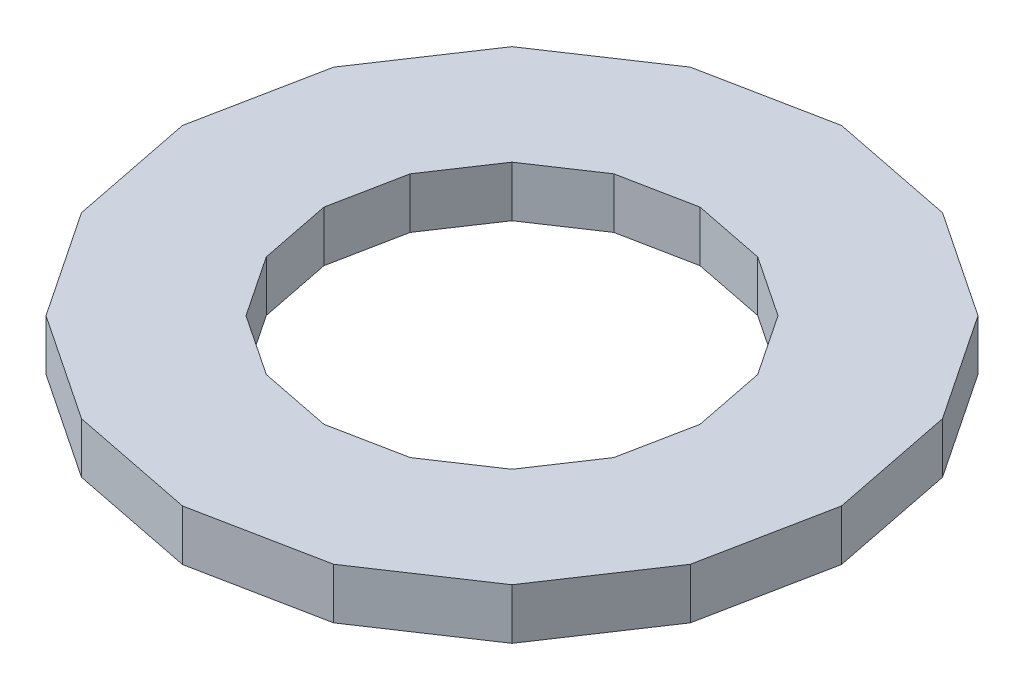
ISO-10303-21;
HEADER;
FILE_DESCRIPTION(('STEP AP214'),'2;1');
FILE_NAME('part.step','',(''),(''),'','','');
FILE_SCHEMA(('AUTOMOTIVE_DESIGN { 1 0 10303 214 1 1 1 1 }'));
ENDSEC;
DATA;
#1=APPLICATION_CONTEXT('core data for automotive mechanical design processes');
#2=APPLICATION_PROTOCOL_DEFINITION('international standard','automotive_design',2000,#1);
#3=PRODUCT_CONTEXT('',#1,'mechanical');
#4=PRODUCT('Part','Part','',(#3));
#5=PRODUCT_RELATED_PRODUCT_CATEGORY('part','',(#4));
#6=PRODUCT_DEFINITION_FORMATION('','',#4);
#7=PRODUCT_DEFINITION_CONTEXT('part definition',#1,'design');
#8=PRODUCT_DEFINITION('design','',#6,#7);
#9=PRODUCT_DEFINITION_SHAPE('','',#8);
#10=(LENGTH_UNIT() NAMED_UNIT(*) SI_UNIT(.MILLI.,.METRE.));
#11=(NAMED_UNIT(*) PLANE_ANGLE_UNIT() SI_UNIT($,.RADIAN.));
#12=(NAMED_UNIT(*) SI_UNIT($,.STERADIAN.) SOLID_ANGLE_UNIT());
#13=UNCERTAINTY_MEASURE_WITH_UNIT(LENGTH_MEASURE(1.E-05),#10,'distance_accuracy_value','');
#14=(GEOMETRIC_REPRESENTATION_CONTEXT(3) GLOBAL_UNCERTAINTY_ASSIGNED_CONTEXT((#13)) GLOBAL_UNIT_ASSIGNED_CONTEXT((#10,
#11,#12)) REPRESENTATION_CONTEXT('',''));
#15=CARTESIAN_POINT('',(0.,0.,0.));
#16=DIRECTION('',(0.,0.,1.));
#17=DIRECTION('',(1.,0.,0.));
#18=AXIS2_PLACEMENT_3D('',#15,#16,#17);
#19=CARTESIAN_POINT('',(0.,19.05,0.));
#20=DIRECTION('',(0.,1.,0.));
#21=DIRECTION('',(0.,0.,1.));
#22=AXIS2_PLACEMENT_3D('',#19,#20,#21);
#23=PLANE('',#22);
#24=DIRECTION('',(0.195090322016117,0.,-0.980785280403233));
#25=VECTOR('',#24,1.);
#26=CARTESIAN_POINT('',(114.271240567507,19.05,47.3326976322586));
#27=LINE('',#26,#25);
#28=CARTESIAN_POINT('',(114.271240567507,19.05,47.3326976322586));
#29=VERTEX_POINT('',#28);
#30=CARTESIAN_POINT('',(123.686299508005,19.05,-1.42247223363454E-12));
#31=VERTEX_POINT('',#30);
#32=EDGE_CURVE('E372',#29,#31,#27,.T.);
#33=ORIENTED_EDGE('',*,*,#32,.T.);
#34=DIRECTION('',(-0.195090322016139,0.,-0.980785280403228));
#35=VECTOR('',#34,1.);
#36=CARTESIAN_POINT('',(123.686299508005,19.05,-1.42247223363454E-12));
#37=LINE('',#36,#35);
#38=CARTESIAN_POINT('',(114.271240567506,19.05,-47.3326976322612));
#39=VERTEX_POINT('',#38);
#40=EDGE_CURVE('E375',#31,#39,#37,.T.);
#41=ORIENTED_EDGE('',*,*,#40,.T.);
#42=DIRECTION('',(-0.555570233019612,0.,-0.831469612302539));
#43=VECTOR('',#42,1.);
#44=CARTESIAN_POINT('',(114.271240567506,19.05,-47.3326976322612));
#45=LINE('',#44,#43);
#46=CARTESIAN_POINT('',(87.4594211219798,19.05,-87.4594211219818));
#47=VERTEX_POINT('',#46);
#48=EDGE_CURVE('E378',#39,#47,#45,.T.);
#49=ORIENTED_EDGE('',*,*,#48,.T.);
#50=DIRECTION('',(-0.831469612302552,0.,-0.555570233019593));
#51=VECTOR('',#50,1.);
#52=CARTESIAN_POINT('',(87.4594211219798,19.05,-87.4594211219818));
#53=LINE('',#52,#51);
#54=CARTESIAN_POINT('',(47.3326976322586,19.05,-114.271240567507));
#55=VERTEX_POINT('',#54);
#56=EDGE_CURVE('E381',#47,#55,#53,.T.);
#57=ORIENTED_EDGE('',*,*,#56,.T.);
#58=DIRECTION('',(-0.980785280403233,0.,-0.195090322016117));
#59=VECTOR('',#58,1.);
#60=CARTESIAN_POINT('',(47.3326976322586,19.05,-114.271240567507));
#61=LINE('',#60,#59);
#62=CARTESIAN_POINT('',(-1.35996802948859E-12,19.05,-123.686299508005));
#63=VERTEX_POINT('',#62);
#64=EDGE_CURVE('E383',#55,#63,#61,.T.);
#65=ORIENTED_EDGE('',*,*,#64,.T.);
#66=DIRECTION('',(-0.980785280403228,0.,0.195090322016139));
#67=VECTOR('',#66,1.);
#68=CARTESIAN_POINT('',(-1.35996802948859E-12,19.05,-123.686299508005));
#69=LINE('',#68,#67);
#70=CARTESIAN_POINT('',(-47.3326976322613,19.05,-114.271240567506));
#71=VERTEX_POINT('',#70);
#72=EDGE_CURVE('E385',#63,#71,#69,.T.);
#73=ORIENTED_EDGE('',*,*,#72,.T.);
#74=DIRECTION('',(-0.831469612302539,0.,0.555570233019612));
#75=VECTOR('',#74,1.);
#76=CARTESIAN_POINT('',(-47.3326976322613,19.05,-114.271240567506));
#77=LINE('',#76,#75);
#78=CARTESIAN_POINT('',(-87.4594211219818,19.05,-87.4594211219798));
#79=VERTEX_POINT('',#78);
#80=EDGE_CURVE('E387',#71,#79,#77,.T.);
#81=ORIENTED_EDGE('',*,*,#80,.T.);
#82=DIRECTION('',(-0.555570233019593,0.,0.831469612302552));
#83=VECTOR('',#82,1.);
#84=CARTESIAN_POINT('',(-87.4594211219818,19.05,-87.4594211219798));
#85=LINE('',#84,#83);
#86=CARTESIAN_POINT('',(-114.271240567507,19.05,-47.3326976322587));
#87=VERTEX_POINT('',#86);
#88=EDGE_CURVE('E389',#79,#87,#85,.T.);
#89=ORIENTED_EDGE('',*,*,#88,.T.);
#90=DIRECTION('',(-0.195090322016117,0.,0.980785280403233));
#91=VECTOR('',#90,1.);
#92=CARTESIAN_POINT('',(-114.271240567507,19.05,-47.3326976322587));
#93=LINE('',#92,#91);
#94=CARTESIAN_POINT('',(-123.686299508005,19.05,1.42259267898905E-12));
#95=VERTEX_POINT('',#94);
#96=EDGE_CURVE('E391',#87,#95,#93,.T.);
#97=ORIENTED_EDGE('',*,*,#96,.T.);
#98=DIRECTION('',(0.195090322016139,0.,0.980785280403228));
#99=VECTOR('',#98,1.);
#100=CARTESIAN_POINT('',(-123.686299508005,19.05,1.42259267898905E-12));
#101=LINE('',#100,#99);
#102=CARTESIAN_POINT('',(-114.271240567506,19.05,47.3326976322612));
#103=VERTEX_POINT('',#102);
#104=EDGE_CURVE('E393',#95,#103,#101,.T.);
#105=ORIENTED_EDGE('',*,*,#104,.T.);
#106=DIRECTION('',(0.555570233019612,0.,0.831469612302539));
#107=VECTOR('',#106,1.);
#108=CARTESIAN_POINT('',(-114.271240567506,19.05,47.3326976322612));
#109=LINE('',#108,#107);
#110=CARTESIAN_POINT('',(-87.4594211219798,19.05,87.4594211219818));
#111=VERTEX_POINT('',#110);
#112=EDGE_CURVE('E395',#103,#111,#109,.T.);
#113=ORIENTED_EDGE('',*,*,#112,.T.);
#114=DIRECTION('',(0.831469612302551,0.,0.555570233019593));
#115=VECTOR('',#114,1.);
#116=CARTESIAN_POINT('',(-87.4594211219798,19.05,87.4594211219818));
#117=LINE('',#116,#115);
#118=CARTESIAN_POINT('',(-47.3326976322586,19.05,114.271240567507));
#119=VERTEX_POINT('',#118);
#120=EDGE_CURVE('E397',#111,#119,#117,.T.);
#121=ORIENTED_EDGE('',*,*,#120,.T.);
#122=DIRECTION('',(0.980785280403233,0.,0.195090322016117));
#123=VECTOR('',#122,1.);
#124=CARTESIAN_POINT('',(-47.3326976322586,19.05,114.271240567507));
#125=LINE('',#124,#123);
#126=CARTESIAN_POINT('',(1.38729359431057E-12,19.05,123.686299508005));
#127=VERTEX_POINT('',#126);
#128=EDGE_CURVE('E399',#119,#127,#125,.T.);
#129=ORIENTED_EDGE('',*,*,#128,.T.);
#130=DIRECTION('',(0.980785280403228,0.,-0.195090322016139));
#131=VECTOR('',#130,1.);
#132=CARTESIAN_POINT('',(1.38729359431057E-12,19.05,123.686299508005));
#133=LINE('',#132,#131);
#134=CARTESIAN_POINT('',(47.3326976322612,19.05,114.271240567506));
#135=VERTEX_POINT('',#134);
#136=EDGE_CURVE('E401',#127,#135,#133,.T.);
#137=ORIENTED_EDGE('',*,*,#136,.T.);
#138=DIRECTION('',(0.831469612302539,0.,-0.555570233019612));
#139=VECTOR('',#138,1.);
#140=CARTESIAN_POINT('',(47.3326976322612,19.05,114.271240567506));
#141=LINE('',#140,#139);
#142=CARTESIAN_POINT('',(87.4594211219818,19.05,87.4594211219798));
#143=VERTEX_POINT('',#142);
#144=EDGE_CURVE('E403',#135,#143,#141,.T.);
#145=ORIENTED_EDGE('',*,*,#144,.T.);
#146=DIRECTION('',(0.555570233019593,0.,-0.831469612302551));
#147=VECTOR('',#146,1.);
#148=CARTESIAN_POINT('',(87.4594211219818,19.05,87.4594211219798));
#149=LINE('',#148,#147);
#150=EDGE_CURVE('E405',#143,#29,#149,.T.);
#151=ORIENTED_EDGE('',*,*,#150,.T.);
#152=EDGE_LOOP('',(#33,#41,#49,#57,#65,#73,#81,#89,#97,#105,#113,#121,#129,#137,#145,#151));
#153=FACE_BOUND('',#152,.T.);
#154=DIRECTION('',(-0.195090322016139,0.,-0.980785280403228));
#155=VECTOR('',#154,1.);
#156=CARTESIAN_POINT('',(70.596187900098,19.05,-8.33173126134152E-13));
#157=LINE('',#156,#155);
#158=CARTESIAN_POINT('',(70.596187900098,19.05,-8.33173126134152E-13));
#159=VERTEX_POINT('',#158);
#160=CARTESIAN_POINT('',(65.2223730742212,19.05,-27.0159914975011));
#161=VERTEX_POINT('',#160);
#162=EDGE_CURVE('E252',#159,#161,#157,.T.);
#163=ORIENTED_EDGE('',*,*,#162,.F.);
#164=DIRECTION('',(0.195090322016117,0.,-0.980785280403233));
#165=VECTOR('',#164,1.);
#166=CARTESIAN_POINT('',(65.2223730742218,19.05,27.0159914974996));
#167=LINE('',#166,#165);
#168=CARTESIAN_POINT('',(65.2223730742218,19.05,27.0159914974996));
#169=VERTEX_POINT('',#168);
#170=EDGE_CURVE('E244',#169,#159,#167,.T.);
#171=ORIENTED_EDGE('',*,*,#170,.F.);
#172=DIRECTION('',(0.555570233019593,0.,-0.831469612302552));
#173=VECTOR('',#172,1.);
#174=CARTESIAN_POINT('',(49.9190431900796,19.05,49.9190431900784));
#175=LINE('',#174,#173);
#176=CARTESIAN_POINT('',(49.9190431900796,19.05,49.9190431900784));
#177=VERTEX_POINT('',#176);
#178=EDGE_CURVE('E298',#177,#169,#175,.T.);
#179=ORIENTED_EDGE('',*,*,#178,.F.);
#180=DIRECTION('',(0.831469612302539,0.,-0.555570233019612));
#181=VECTOR('',#180,1.);
#182=CARTESIAN_POINT('',(27.0159914975011,19.05,65.2223730742212));
#183=LINE('',#182,#181);
#184=CARTESIAN_POINT('',(27.0159914975011,19.05,65.2223730742212));
#185=VERTEX_POINT('',#184);
#186=EDGE_CURVE('E295',#185,#177,#183,.T.);
#187=ORIENTED_EDGE('',*,*,#186,.F.);
#188=DIRECTION('',(0.980785280403228,0.,-0.195090322016139));
#189=VECTOR('',#188,1.);
#190=CARTESIAN_POINT('',(8.41509792691654E-13,19.05,70.596187900098));
#191=LINE('',#190,#189);
#192=CARTESIAN_POINT('',(8.41509792691654E-13,19.05,70.596187900098));
#193=VERTEX_POINT('',#192);
#194=EDGE_CURVE('E293',#193,#185,#191,.T.);
#195=ORIENTED_EDGE('',*,*,#194,.F.);
#196=DIRECTION('',(0.980785280403233,0.,0.195090322016117));
#197=VECTOR('',#196,1.);
#198=CARTESIAN_POINT('',(-27.0159914974996,19.05,65.2223730742218));
#199=LINE('',#198,#197);
#200=CARTESIAN_POINT('',(-27.0159914974996,19.05,65.2223730742218));
#201=VERTEX_POINT('',#200);
#202=EDGE_CURVE('E291',#201,#193,#199,.T.);
#203=ORIENTED_EDGE('',*,*,#202,.F.);
#204=DIRECTION('',(0.831469612302552,0.,0.555570233019592));
#205=VECTOR('',#204,1.);
#206=CARTESIAN_POINT('',(-49.9190431900784,19.05,49.9190431900796));
#207=LINE('',#206,#205);
#208=CARTESIAN_POINT('',(-49.9190431900784,19.05,49.9190431900796));
#209=VERTEX_POINT('',#208);
#210=EDGE_CURVE('E289',#209,#201,#207,.T.);
#211=ORIENTED_EDGE('',*,*,#210,.F.);
#212=DIRECTION('',(0.555570233019612,0.,0.831469612302539));
#213=VECTOR('',#212,1.);
#214=CARTESIAN_POINT('',(-65.2223730742212,19.05,27.0159914975011));
#215=LINE('',#214,#213);
#216=CARTESIAN_POINT('',(-65.2223730742212,19.05,27.0159914975011));
#217=VERTEX_POINT('',#216);
#218=EDGE_CURVE('E287',#217,#209,#215,.T.);
#219=ORIENTED_EDGE('',*,*,#218,.F.);
#220=DIRECTION('',(0.195090322016139,0.,0.980785280403228));
#221=VECTOR('',#220,1.);
#222=CARTESIAN_POINT('',(-70.596187900098,19.05,8.60888085877906E-13));
#223=LINE('',#222,#221);
#224=CARTESIAN_POINT('',(-70.596187900098,19.05,8.60888085877906E-13));
#225=VERTEX_POINT('',#224);
#226=EDGE_CURVE('E285',#225,#217,#223,.T.);
#227=ORIENTED_EDGE('',*,*,#226,.F.);
#228=DIRECTION('',(-0.195090322016116,0.,0.980785280403233));
#229=VECTOR('',#228,1.);
#230=CARTESIAN_POINT('',(-65.2223730742218,19.05,-27.0159914974996));
#231=LINE('',#230,#229);
#232=CARTESIAN_POINT('',(-65.2223730742218,19.05,-27.0159914974996));
#233=VERTEX_POINT('',#232);
#234=EDGE_CURVE('E283',#233,#225,#231,.T.);
#235=ORIENTED_EDGE('',*,*,#234,.F.);
#236=DIRECTION('',(-0.555570233019593,0.,0.831469612302552));
#237=VECTOR('',#236,1.);
#238=CARTESIAN_POINT('',(-49.9190431900796,19.05,-49.9190431900784));
#239=LINE('',#238,#237);
#240=CARTESIAN_POINT('',(-49.9190431900796,19.05,-49.9190431900784));
#241=VERTEX_POINT('',#240);
#242=EDGE_CURVE('E281',#241,#233,#239,.T.);
#243=ORIENTED_EDGE('',*,*,#242,.F.);
#244=DIRECTION('',(-0.831469612302539,0.,0.555570233019612));
#245=VECTOR('',#244,1.);
#246=CARTESIAN_POINT('',(-27.0159914975011,19.05,-65.2223730742212));
#247=LINE('',#246,#245);
#248=CARTESIAN_POINT('',(-27.0159914975011,19.05,-65.2223730742212));
#249=VERTEX_POINT('',#248);
#250=EDGE_CURVE('E279',#249,#241,#247,.T.);
#251=ORIENTED_EDGE('',*,*,#250,.F.);
#252=DIRECTION('',(-0.980785280403228,0.,0.195090322016139));
#253=VECTOR('',#252,1.);
#254=CARTESIAN_POINT('',(-8.32997457003627E-13,19.05,-70.596187900098));
#255=LINE('',#254,#253);
#256=CARTESIAN_POINT('',(-8.32997457003627E-13,19.05,-70.596187900098));
#257=VERTEX_POINT('',#256);
#258=EDGE_CURVE('E277',#257,#249,#255,.T.);
#259=ORIENTED_EDGE('',*,*,#258,.F.);
#260=DIRECTION('',(-0.980785280403233,0.,-0.195090322016117));
#261=VECTOR('',#260,1.);
#262=CARTESIAN_POINT('',(27.0159914974997,19.05,-65.2223730742218));
#263=LINE('',#262,#261);
#264=CARTESIAN_POINT('',(27.0159914974997,19.05,-65.2223730742218));
#265=VERTEX_POINT('',#264);
#266=EDGE_CURVE('E275',#265,#257,#263,.T.);
#267=ORIENTED_EDGE('',*,*,#266,.F.);
#268=DIRECTION('',(-0.831469612302552,0.,-0.555570233019592));
#269=VECTOR('',#268,1.);
#270=CARTESIAN_POINT('',(49.9190431900784,19.05,-49.9190431900796));
#271=LINE('',#270,#269);
#272=CARTESIAN_POINT('',(49.9190431900784,19.05,-49.9190431900796));
#273=VERTEX_POINT('',#272);
#274=EDGE_CURVE('E271',#273,#265,#271,.T.);
#275=ORIENTED_EDGE('',*,*,#274,.F.);
#276=DIRECTION('',(-0.555570233019612,0.,-0.831469612302539));
#277=VECTOR('',#276,1.);
#278=CARTESIAN_POINT('',(65.2223730742212,19.05,-27.0159914975011));
#279=LINE('',#278,#277);
#280=EDGE_CURVE('E265',#161,#273,#279,.T.);
#281=ORIENTED_EDGE('',*,*,#280,.F.);
#282=EDGE_LOOP('',(#163,#171,#179,#187,#195,#203,#211,#219,#227,#235,#243,#251,#259,#267,#275,#281));
#283=FACE_BOUND('',#282,.T.);
#284=ADVANCED_FACE('F35',(#153,#283),#23,.T.);
#285=CARTESIAN_POINT('',(0.,0.,0.));
#286=DIRECTION('',(0.,1.,0.));
#287=DIRECTION('',(0.,0.,1.));
#288=AXIS2_PLACEMENT_3D('',#285,#286,#287);
#289=PLANE('',#288);
#290=DIRECTION('',(0.195090322016117,0.,-0.980785280403233));
#291=VECTOR('',#290,1.);
#292=CARTESIAN_POINT('',(114.271240567507,0.,47.3326976322586));
#293=LINE('',#292,#291);
#294=CARTESIAN_POINT('',(114.271240567507,0.,47.3326976322586));
#295=VERTEX_POINT('',#294);
#296=CARTESIAN_POINT('',(123.686299508005,0.,-1.42247223363454E-12));
#297=VERTEX_POINT('',#296);
#298=EDGE_CURVE('E260',#295,#297,#293,.T.);
#299=ORIENTED_EDGE('',*,*,#298,.F.);
#300=DIRECTION('',(0.555570233019593,0.,-0.831469612302551));
#301=VECTOR('',#300,1.);
#302=CARTESIAN_POINT('',(87.4594211219818,0.,87.4594211219798));
#303=LINE('',#302,#301);
#304=CARTESIAN_POINT('',(87.4594211219818,0.,87.4594211219798));
#305=VERTEX_POINT('',#304);
#306=EDGE_CURVE('E376',#305,#295,#303,.T.);
#307=ORIENTED_EDGE('',*,*,#306,.F.);
#308=DIRECTION('',(0.831469612302539,0.,-0.555570233019612));
#309=VECTOR('',#308,1.);
#310=CARTESIAN_POINT('',(47.3326976322612,0.,114.271240567506));
#311=LINE('',#310,#309);
#312=CARTESIAN_POINT('',(47.3326976322612,0.,114.271240567506));
#313=VERTEX_POINT('',#312);
#314=EDGE_CURVE('E437',#313,#305,#311,.T.);
#315=ORIENTED_EDGE('',*,*,#314,.F.);
#316=DIRECTION('',(0.980785280403228,0.,-0.195090322016139));
#317=VECTOR('',#316,1.);
#318=CARTESIAN_POINT('',(1.38729359431057E-12,0.,123.686299508005));
#319=LINE('',#318,#317);
#320=CARTESIAN_POINT('',(1.38729359431057E-12,0.,123.686299508005));
#321=VERTEX_POINT('',#320);
#322=EDGE_CURVE('E435',#321,#313,#319,.T.);
#323=ORIENTED_EDGE('',*,*,#322,.F.);
#324=DIRECTION('',(0.980785280403233,0.,0.195090322016117));
#325=VECTOR('',#324,1.);
#326=CARTESIAN_POINT('',(-47.3326976322586,0.,114.271240567507));
#327=LINE('',#326,#325);
#328=CARTESIAN_POINT('',(-47.3326976322586,0.,114.271240567507));
#329=VERTEX_POINT('',#328);
#330=EDGE_CURVE('E433',#329,#321,#327,.T.);
#331=ORIENTED_EDGE('',*,*,#330,.F.);
#332=DIRECTION('',(0.831469612302551,0.,0.555570233019593));
#333=VECTOR('',#332,1.);
#334=CARTESIAN_POINT('',(-87.4594211219798,0.,87.4594211219818));
#335=LINE('',#334,#333);
#336=CARTESIAN_POINT('',(-87.4594211219798,0.,87.4594211219818));
#337=VERTEX_POINT('',#336);
#338=EDGE_CURVE('E431',#337,#329,#335,.T.);
#339=ORIENTED_EDGE('',*,*,#338,.F.);
#340=DIRECTION('',(0.555570233019612,0.,0.831469612302539));
#341=VECTOR('',#340,1.);
#342=CARTESIAN_POINT('',(-114.271240567506,0.,47.3326976322612));
#343=LINE('',#342,#341);
#344=CARTESIAN_POINT('',(-114.271240567506,0.,47.3326976322612));
#345=VERTEX_POINT('',#344);
#346=EDGE_CURVE('E429',#345,#337,#343,.T.);
#347=ORIENTED_EDGE('',*,*,#346,.F.);
#348=DIRECTION('',(0.195090322016139,0.,0.980785280403228));
#349=VECTOR('',#348,1.);
#350=CARTESIAN_POINT('',(-123.686299508005,0.,1.42259267898905E-12));
#351=LINE('',#350,#349);
#352=CARTESIAN_POINT('',(-123.686299508005,0.,1.42259267898905E-12));
#353=VERTEX_POINT('',#352);
#354=EDGE_CURVE('E427',#353,#345,#351,.T.);
#355=ORIENTED_EDGE('',*,*,#354,.F.);
#356=DIRECTION('',(-0.195090322016117,0.,0.980785280403233));
#357=VECTOR('',#356,1.);
#358=CARTESIAN_POINT('',(-114.271240567507,0.,-47.3326976322587));
#359=LINE('',#358,#357);
#360=CARTESIAN_POINT('',(-114.271240567507,0.,-47.3326976322587));
#361=VERTEX_POINT('',#360);
#362=EDGE_CURVE('E425',#361,#353,#359,.T.);
#363=ORIENTED_EDGE('',*,*,#362,.F.);
#364=DIRECTION('',(-0.555570233019593,0.,0.831469612302552));
#365=VECTOR('',#364,1.);
#366=CARTESIAN_POINT('',(-87.4594211219818,0.,-87.4594211219798));
#367=LINE('',#366,#365);
#368=CARTESIAN_POINT('',(-87.4594211219818,0.,-87.4594211219798));
#369=VERTEX_POINT('',#368);
#370=EDGE_CURVE('E423',#369,#361,#367,.T.);
#371=ORIENTED_EDGE('',*,*,#370,.F.);
#372=DIRECTION('',(-0.831469612302539,0.,0.555570233019612));
#373=VECTOR('',#372,1.);
#374=CARTESIAN_POINT('',(-47.3326976322613,0.,-114.271240567506));
#375=LINE('',#374,#373);
#376=CARTESIAN_POINT('',(-47.3326976322613,0.,-114.271240567506));
#377=VERTEX_POINT('',#376);
#378=EDGE_CURVE('E421',#377,#369,#375,.T.);
#379=ORIENTED_EDGE('',*,*,#378,.F.);
#380=DIRECTION('',(-0.980785280403228,0.,0.195090322016139));
#381=VECTOR('',#380,1.);
#382=CARTESIAN_POINT('',(-1.35996802948859E-12,0.,-123.686299508005));
#383=LINE('',#382,#381);
#384=CARTESIAN_POINT('',(-1.35996802948859E-12,0.,-123.686299508005));
#385=VERTEX_POINT('',#384);
#386=EDGE_CURVE('E419',#385,#377,#383,.T.);
#387=ORIENTED_EDGE('',*,*,#386,.F.);
#388=DIRECTION('',(-0.980785280403233,0.,-0.195090322016117));
#389=VECTOR('',#388,1.);
#390=CARTESIAN_POINT('',(47.3326976322586,0.,-114.271240567507));
#391=LINE('',#390,#389);
#392=CARTESIAN_POINT('',(47.3326976322586,0.,-114.271240567507));
#393=VERTEX_POINT('',#392);
#394=EDGE_CURVE('E417',#393,#385,#391,.T.);
#395=ORIENTED_EDGE('',*,*,#394,.F.);
#396=DIRECTION('',(-0.831469612302552,0.,-0.555570233019593));
#397=VECTOR('',#396,1.);
#398=CARTESIAN_POINT('',(87.4594211219798,0.,-87.4594211219818));
#399=LINE('',#398,#397);
#400=CARTESIAN_POINT('',(87.4594211219798,0.,-87.4594211219818));
#401=VERTEX_POINT('',#400);
#402=EDGE_CURVE('E415',#401,#393,#399,.T.);
#403=ORIENTED_EDGE('',*,*,#402,.F.);
#404=DIRECTION('',(-0.555570233019612,0.,-0.831469612302539));
#405=VECTOR('',#404,1.);
#406=CARTESIAN_POINT('',(114.271240567506,0.,-47.3326976322612));
#407=LINE('',#406,#405);
#408=CARTESIAN_POINT('',(114.271240567506,0.,-47.3326976322612));
#409=VERTEX_POINT('',#408);
#410=EDGE_CURVE('E412',#409,#401,#407,.T.);
#411=ORIENTED_EDGE('',*,*,#410,.F.);
#412=DIRECTION('',(-0.195090322016139,0.,-0.980785280403228));
#413=VECTOR('',#412,1.);
#414=CARTESIAN_POINT('',(123.686299508005,0.,-1.42247223363454E-12));
#415=LINE('',#414,#413);
#416=EDGE_CURVE('E410',#297,#409,#415,.T.);
#417=ORIENTED_EDGE('',*,*,#416,.F.);
#418=EDGE_LOOP('',(#299,#307,#315,#323,#331,#339,#347,#355,#363,#371,#379,#387,#395,#403,#411,#417));
#419=FACE_BOUND('',#418,.T.);
#420=DIRECTION('',(0.195090322016117,0.,-0.980785280403233));
#421=VECTOR('',#420,1.);
#422=CARTESIAN_POINT('',(65.2223730742218,0.,27.0159914974996));
#423=LINE('',#422,#421);
#424=CARTESIAN_POINT('',(65.2223730742219,0.,27.0159914974996));
#425=VERTEX_POINT('',#424);
#426=CARTESIAN_POINT('',(70.596187900098,0.,-8.33173126134152E-13));
#427=VERTEX_POINT('',#426);
#428=EDGE_CURVE('E58',#425,#427,#423,.T.);
#429=ORIENTED_EDGE('',*,*,#428,.T.);
#430=DIRECTION('',(-0.195090322016139,0.,-0.980785280403228));
#431=VECTOR('',#430,1.);
#432=CARTESIAN_POINT('',(70.596187900098,0.,-8.33173126134152E-13));
#433=LINE('',#432,#431);
#434=CARTESIAN_POINT('',(65.2223730742212,0.,-27.0159914975011));
#435=VERTEX_POINT('',#434);
#436=EDGE_CURVE('E259',#427,#435,#433,.T.);
#437=ORIENTED_EDGE('',*,*,#436,.T.);
#438=DIRECTION('',(-0.555570233019612,0.,-0.831469612302539));
#439=VECTOR('',#438,1.);
#440=CARTESIAN_POINT('',(65.2223730742212,0.,-27.0159914975011));
#441=LINE('',#440,#439);
#442=CARTESIAN_POINT('',(49.9190431900784,0.,-49.9190431900796));
#443=VERTEX_POINT('',#442);
#444=EDGE_CURVE('E302',#435,#443,#441,.T.);
#445=ORIENTED_EDGE('',*,*,#444,.T.);
#446=DIRECTION('',(-0.831469612302552,0.,-0.555570233019592));
#447=VECTOR('',#446,1.);
#448=CARTESIAN_POINT('',(49.9190431900784,0.,-49.9190431900796));
#449=LINE('',#448,#447);
#450=CARTESIAN_POINT('',(27.0159914974997,0.,-65.2223730742218));
#451=VERTEX_POINT('',#450);
#452=EDGE_CURVE('E305',#443,#451,#449,.T.);
#453=ORIENTED_EDGE('',*,*,#452,.T.);
#454=DIRECTION('',(-0.980785280403233,0.,-0.195090322016117));
#455=VECTOR('',#454,1.);
#456=CARTESIAN_POINT('',(27.0159914974997,0.,-65.2223730742218));
#457=LINE('',#456,#455);
#458=CARTESIAN_POINT('',(-8.32997457003627E-13,0.,-70.596187900098));
#459=VERTEX_POINT('',#458);
#460=EDGE_CURVE('E308',#451,#459,#457,.T.);
#461=ORIENTED_EDGE('',*,*,#460,.T.);
#462=DIRECTION('',(-0.980785280403228,0.,0.195090322016139));
#463=VECTOR('',#462,1.);
#464=CARTESIAN_POINT('',(-8.32997457003627E-13,0.,-70.596187900098));
#465=LINE('',#464,#463);
#466=CARTESIAN_POINT('',(-27.0159914975011,0.,-65.2223730742212));
#467=VERTEX_POINT('',#466);
#468=EDGE_CURVE('E311',#459,#467,#465,.T.);
#469=ORIENTED_EDGE('',*,*,#468,.T.);
#470=DIRECTION('',(-0.831469612302539,0.,0.555570233019612));
#471=VECTOR('',#470,1.);
#472=CARTESIAN_POINT('',(-27.0159914975011,0.,-65.2223730742212));
#473=LINE('',#472,#471);
#474=CARTESIAN_POINT('',(-49.9190431900796,0.,-49.9190431900784));
#475=VERTEX_POINT('',#474);
#476=EDGE_CURVE('E314',#467,#475,#473,.T.);
#477=ORIENTED_EDGE('',*,*,#476,.T.);
#478=DIRECTION('',(-0.555570233019593,0.,0.831469612302552));
#479=VECTOR('',#478,1.);
#480=CARTESIAN_POINT('',(-49.9190431900796,0.,-49.9190431900784));
#481=LINE('',#480,#479);
#482=CARTESIAN_POINT('',(-65.2223730742218,0.,-27.0159914974996));
#483=VERTEX_POINT('',#482);
#484=EDGE_CURVE('E317',#475,#483,#481,.T.);
#485=ORIENTED_EDGE('',*,*,#484,.T.);
#486=DIRECTION('',(-0.195090322016116,0.,0.980785280403233));
#487=VECTOR('',#486,1.);
#488=CARTESIAN_POINT('',(-65.2223730742218,0.,-27.0159914974996));
#489=LINE('',#488,#487);
#490=CARTESIAN_POINT('',(-70.596187900098,0.,8.60888085877906E-13));
#491=VERTEX_POINT('',#490);
#492=EDGE_CURVE('E320',#483,#491,#489,.T.);
#493=ORIENTED_EDGE('',*,*,#492,.T.);
#494=DIRECTION('',(0.195090322016139,0.,0.980785280403228));
#495=VECTOR('',#494,1.);
#496=CARTESIAN_POINT('',(-70.596187900098,0.,8.60888085877906E-13));
#497=LINE('',#496,#495);
#498=CARTESIAN_POINT('',(-65.2223730742212,0.,27.0159914975011));
#499=VERTEX_POINT('',#498);
#500=EDGE_CURVE('E323',#491,#499,#497,.T.);
#501=ORIENTED_EDGE('',*,*,#500,.T.);
#502=DIRECTION('',(0.555570233019612,0.,0.831469612302539));
#503=VECTOR('',#502,1.);
#504=CARTESIAN_POINT('',(-65.2223730742212,0.,27.0159914975011));
#505=LINE('',#504,#503);
#506=CARTESIAN_POINT('',(-49.9190431900784,0.,49.9190431900796));
#507=VERTEX_POINT('',#506);
#508=EDGE_CURVE('E326',#499,#507,#505,.T.);
#509=ORIENTED_EDGE('',*,*,#508,.T.);
#510=DIRECTION('',(0.831469612302552,0.,0.555570233019592));
#511=VECTOR('',#510,1.);
#512=CARTESIAN_POINT('',(-49.9190431900784,0.,49.9190431900796));
#513=LINE('',#512,#511);
#514=CARTESIAN_POINT('',(-27.0159914974996,0.,65.2223730742218));
#515=VERTEX_POINT('',#514);
#516=EDGE_CURVE('E329',#507,#515,#513,.T.);
#517=ORIENTED_EDGE('',*,*,#516,.T.);
#518=DIRECTION('',(0.980785280403233,0.,0.195090322016117));
#519=VECTOR('',#518,1.);
#520=CARTESIAN_POINT('',(-27.0159914974996,0.,65.2223730742218));
#521=LINE('',#520,#519);
#522=CARTESIAN_POINT('',(8.41509792691654E-13,0.,70.596187900098));
#523=VERTEX_POINT('',#522);
#524=EDGE_CURVE('E332',#515,#523,#521,.T.);
#525=ORIENTED_EDGE('',*,*,#524,.T.);
#526=DIRECTION('',(0.980785280403228,0.,-0.195090322016139));
#527=VECTOR('',#526,1.);
#528=CARTESIAN_POINT('',(8.41509792691654E-13,0.,70.596187900098));
#529=LINE('',#528,#527);
#530=CARTESIAN_POINT('',(27.0159914975011,0.,65.2223730742212));
#531=VERTEX_POINT('',#530);
#532=EDGE_CURVE('E335',#523,#531,#529,.T.);
#533=ORIENTED_EDGE('',*,*,#532,.T.);
#534=DIRECTION('',(0.831469612302539,0.,-0.555570233019612));
#535=VECTOR('',#534,1.);
#536=CARTESIAN_POINT('',(27.0159914975011,0.,65.2223730742212));
#537=LINE('',#536,#535);
#538=CARTESIAN_POINT('',(49.9190431900796,0.,49.9190431900784));
#539=VERTEX_POINT('',#538);
#540=EDGE_CURVE('E338',#531,#539,#537,.T.);
#541=ORIENTED_EDGE('',*,*,#540,.T.);
#542=DIRECTION('',(0.555570233019593,0.,-0.831469612302552));
#543=VECTOR('',#542,1.);
#544=CARTESIAN_POINT('',(49.9190431900796,0.,49.9190431900784));
#545=LINE('',#544,#543);
#546=EDGE_CURVE('E253',#539,#425,#545,.T.);
#547=ORIENTED_EDGE('',*,*,#546,.T.);
#548=EDGE_LOOP('',(#429,#437,#445,#453,#461,#469,#477,#485,#493,#501,#509,#517,#525,#533,#541,#547));
#549=FACE_BOUND('',#548,.T.);
#550=ADVANCED_FACE('F495',(#419,#549),#289,.F.);
#551=CARTESIAN_POINT('',(114.271240567507,19.05,47.3326976322586));
#552=DIRECTION('',(-0.980785280403233,0.,-0.195090322016117));
#553=DIRECTION('',(-0.195090322016117,0.,0.980785280403233));
#554=AXIS2_PLACEMENT_3D('',#551,#552,#553);
#555=PLANE('',#554);
#556=ORIENTED_EDGE('',*,*,#298,.T.);
#557=DIRECTION('',(0.,-1.,0.));
#558=VECTOR('',#557,1.);
#559=CARTESIAN_POINT('',(123.686299508005,19.05,-1.42247223363454E-12));
#560=LINE('',#559,#558);
#561=EDGE_CURVE('E11',#31,#297,#560,.T.);
#562=ORIENTED_EDGE('',*,*,#561,.F.);
#563=ORIENTED_EDGE('',*,*,#32,.F.);
#564=DIRECTION('',(0.,-1.,0.));
#565=VECTOR('',#564,1.);
#566=CARTESIAN_POINT('',(114.271240567507,19.05,47.3326976322586));
#567=LINE('',#566,#565);
#568=EDGE_CURVE('E407',#29,#295,#567,.T.);
#569=ORIENTED_EDGE('',*,*,#568,.T.);
#570=EDGE_LOOP('',(#556,#562,#563,#569));
#571=FACE_BOUND('',#570,.T.);
#572=ADVANCED_FACE('F37',(#571),#555,.F.);
#573=CARTESIAN_POINT('',(123.686299508005,19.05,-1.42247223363454E-12));
#574=DIRECTION('',(-0.980785280403228,0.,0.195090322016139));
#575=DIRECTION('',(0.195090322016139,0.,0.980785280403228));
#576=AXIS2_PLACEMENT_3D('',#573,#574,#575);
#577=PLANE('',#576);
#578=ORIENTED_EDGE('',*,*,#416,.T.);
#579=DIRECTION('',(0.,-1.,0.));
#580=VECTOR('',#579,1.);
#581=CARTESIAN_POINT('',(114.271240567506,19.05,-47.3326976322612));
#582=LINE('',#581,#580);
#583=EDGE_CURVE('E43',#39,#409,#582,.T.);
#584=ORIENTED_EDGE('',*,*,#583,.F.);
#585=ORIENTED_EDGE('',*,*,#40,.F.);
#586=ORIENTED_EDGE('',*,*,#561,.T.);
#587=EDGE_LOOP('',(#578,#584,#585,#586));
#588=FACE_BOUND('',#587,.T.);
#589=ADVANCED_FACE('F512',(#588),#577,.F.);
#590=CARTESIAN_POINT('',(114.271240567506,19.05,-47.3326976322612));
#591=DIRECTION('',(-0.831469612302539,0.,0.555570233019612));
#592=DIRECTION('',(0.555570233019612,0.,0.831469612302539));
#593=AXIS2_PLACEMENT_3D('',#590,#591,#592);
#594=PLANE('',#593);
#595=ORIENTED_EDGE('',*,*,#410,.T.);
#596=DIRECTION('',(0.,-1.,0.));
#597=VECTOR('',#596,1.);
#598=CARTESIAN_POINT('',(87.4594211219798,19.05,-87.4594211219818));
#599=LINE('',#598,#597);
#600=EDGE_CURVE('E480',#47,#401,#599,.T.);
#601=ORIENTED_EDGE('',*,*,#600,.F.);
#602=ORIENTED_EDGE('',*,*,#48,.F.);
#603=ORIENTED_EDGE('',*,*,#583,.T.);
#604=EDGE_LOOP('',(#595,#601,#602,#603));
#605=FACE_BOUND('',#604,.T.);
#606=ADVANCED_FACE('F489',(#605),#594,.F.);
#607=CARTESIAN_POINT('',(87.4594211219798,19.05,-87.4594211219818));
#608=DIRECTION('',(-0.555570233019593,0.,0.831469612302552));
#609=DIRECTION('',(0.831469612302552,0.,0.555570233019593));
#610=AXIS2_PLACEMENT_3D('',#607,#608,#609);
#611=PLANE('',#610);
#612=ORIENTED_EDGE('',*,*,#402,.T.);
#613=DIRECTION('',(0.,-1.,0.));
#614=VECTOR('',#613,1.);
#615=CARTESIAN_POINT('',(47.3326976322586,19.05,-114.271240567507));
#616=LINE('',#615,#614);
#617=EDGE_CURVE('E477',#55,#393,#616,.T.);
#618=ORIENTED_EDGE('',*,*,#617,.F.);
#619=ORIENTED_EDGE('',*,*,#56,.F.);
#620=ORIENTED_EDGE('',*,*,#600,.T.);
#621=EDGE_LOOP('',(#612,#618,#619,#620));
#622=FACE_BOUND('',#621,.T.);
#623=ADVANCED_FACE('F501',(#622),#611,.F.);
#624=CARTESIAN_POINT('',(47.3326976322586,19.05,-114.271240567507));
#625=DIRECTION('',(-0.195090322016117,0.,0.980785280403233));
#626=DIRECTION('',(0.980785280403233,0.,0.195090322016117));
#627=AXIS2_PLACEMENT_3D('',#624,#625,#626);
#628=PLANE('',#627);
#629=ORIENTED_EDGE('',*,*,#394,.T.);
#630=DIRECTION('',(0.,-1.,0.));
#631=VECTOR('',#630,1.);
#632=CARTESIAN_POINT('',(-1.35996802948859E-12,19.05,-123.686299508005));
#633=LINE('',#632,#631);
#634=EDGE_CURVE('E474',#63,#385,#633,.T.);
#635=ORIENTED_EDGE('',*,*,#634,.F.);
#636=ORIENTED_EDGE('',*,*,#64,.F.);
#637=ORIENTED_EDGE('',*,*,#617,.T.);
#638=EDGE_LOOP('',(#629,#635,#636,#637));
#639=FACE_BOUND('',#638,.T.);
#640=ADVANCED_FACE('F505',(#639),#628,.F.);
#641=CARTESIAN_POINT('',(-1.35996802948859E-12,19.05,-123.686299508005));
#642=DIRECTION('',(0.195090322016139,0.,0.980785280403228));
#643=DIRECTION('',(0.980785280403228,0.,-0.195090322016139));
#644=AXIS2_PLACEMENT_3D('',#641,#642,#643);
#645=PLANE('',#644);
#646=ORIENTED_EDGE('',*,*,#386,.T.);
#647=DIRECTION('',(0.,-1.,0.));
#648=VECTOR('',#647,1.);
#649=CARTESIAN_POINT('',(-47.3326976322613,19.05,-114.271240567506));
#650=LINE('',#649,#648);
#651=EDGE_CURVE('E470',#71,#377,#650,.T.);
#652=ORIENTED_EDGE('',*,*,#651,.F.);
#653=ORIENTED_EDGE('',*,*,#72,.F.);
#654=ORIENTED_EDGE('',*,*,#634,.T.);
#655=EDGE_LOOP('',(#646,#652,#653,#654));
#656=FACE_BOUND('',#655,.T.);
#657=ADVANCED_FACE('F565',(#656),#645,.F.);
#658=CARTESIAN_POINT('',(-47.3326976322613,19.05,-114.271240567506));
#659=DIRECTION('',(0.555570233019612,0.,0.831469612302539));
#660=DIRECTION('',(0.831469612302539,0.,-0.555570233019612));
#661=AXIS2_PLACEMENT_3D('',#658,#659,#660);
#662=PLANE('',#661);
#663=ORIENTED_EDGE('',*,*,#378,.T.);
#664=DIRECTION('',(0.,-1.,0.));
#665=VECTOR('',#664,1.);
#666=CARTESIAN_POINT('',(-87.4594211219818,19.05,-87.4594211219798));
#667=LINE('',#666,#665);
#668=EDGE_CURVE('E467',#79,#369,#667,.T.);
#669=ORIENTED_EDGE('',*,*,#668,.F.);
#670=ORIENTED_EDGE('',*,*,#80,.F.);
#671=ORIENTED_EDGE('',*,*,#651,.T.);
#672=EDGE_LOOP('',(#663,#669,#670,#671));
#673=FACE_BOUND('',#672,.T.);
#674=ADVANCED_FACE('F562',(#673),#662,.F.);
#675=CARTESIAN_POINT('',(-87.4594211219818,19.05,-87.4594211219798));
#676=DIRECTION('',(0.831469612302552,0.,0.555570233019593));
#677=DIRECTION('',(0.555570233019593,0.,-0.831469612302552));
#678=AXIS2_PLACEMENT_3D('',#675,#676,#677);
#679=PLANE('',#678);
#680=ORIENTED_EDGE('',*,*,#370,.T.);
#681=DIRECTION('',(0.,-1.,0.));
#682=VECTOR('',#681,1.);
#683=CARTESIAN_POINT('',(-114.271240567507,19.05,-47.3326976322587));
#684=LINE('',#683,#682);
#685=EDGE_CURVE('E464',#87,#361,#684,.T.);
#686=ORIENTED_EDGE('',*,*,#685,.F.);
#687=ORIENTED_EDGE('',*,*,#88,.F.);
#688=ORIENTED_EDGE('',*,*,#668,.T.);
#689=EDGE_LOOP('',(#680,#686,#687,#688));
#690=FACE_BOUND('',#689,.T.);
#691=ADVANCED_FACE('F558',(#690),#679,.F.);
#692=CARTESIAN_POINT('',(-114.271240567507,19.05,-47.3326976322587));
#693=DIRECTION('',(0.980785280403233,0.,0.195090322016117));
#694=DIRECTION('',(0.195090322016117,0.,-0.980785280403233));
#695=AXIS2_PLACEMENT_3D('',#692,#693,#694);
#696=PLANE('',#695);
#697=ORIENTED_EDGE('',*,*,#362,.T.);
#698=DIRECTION('',(0.,-1.,0.));
#699=VECTOR('',#698,1.);
#700=CARTESIAN_POINT('',(-123.686299508005,19.05,1.42259267898905E-12));
#701=LINE('',#700,#699);
#702=EDGE_CURVE('E461',#95,#353,#701,.T.);
#703=ORIENTED_EDGE('',*,*,#702,.F.);
#704=ORIENTED_EDGE('',*,*,#96,.F.);
#705=ORIENTED_EDGE('',*,*,#685,.T.);
#706=EDGE_LOOP('',(#697,#703,#704,#705));
#707=FACE_BOUND('',#706,.T.);
#708=ADVANCED_FACE('F554',(#707),#696,.F.);
#709=CARTESIAN_POINT('',(-123.686299508005,19.05,1.42259267898905E-12));
#710=DIRECTION('',(0.980785280403228,0.,-0.195090322016139));
#711=DIRECTION('',(-0.195090322016139,0.,-0.980785280403228));
#712=AXIS2_PLACEMENT_3D('',#709,#710,#711);
#713=PLANE('',#712);
#714=ORIENTED_EDGE('',*,*,#354,.T.);
#715=DIRECTION('',(0.,-1.,0.));
#716=VECTOR('',#715,1.);
#717=CARTESIAN_POINT('',(-114.271240567506,19.05,47.3326976322612));
#718=LINE('',#717,#716);
#719=EDGE_CURVE('E458',#103,#345,#718,.T.);
#720=ORIENTED_EDGE('',*,*,#719,.F.);
#721=ORIENTED_EDGE('',*,*,#104,.F.);
#722=ORIENTED_EDGE('',*,*,#702,.T.);
#723=EDGE_LOOP('',(#714,#720,#721,#722));
#724=FACE_BOUND('',#723,.T.);
#725=ADVANCED_FACE('F549',(#724),#713,.F.);
#726=CARTESIAN_POINT('',(-114.271240567506,19.05,47.3326976322612));
#727=DIRECTION('',(0.831469612302539,0.,-0.555570233019612));
#728=DIRECTION('',(-0.555570233019612,0.,-0.831469612302539));
#729=AXIS2_PLACEMENT_3D('',#726,#727,#728);
#730=PLANE('',#729);
#731=ORIENTED_EDGE('',*,*,#346,.T.);
#732=DIRECTION('',(0.,-1.,0.));
#733=VECTOR('',#732,1.);
#734=CARTESIAN_POINT('',(-87.4594211219798,19.05,87.4594211219818));
#735=LINE('',#734,#733);
#736=EDGE_CURVE('E455',#111,#337,#735,.T.);
#737=ORIENTED_EDGE('',*,*,#736,.F.);
#738=ORIENTED_EDGE('',*,*,#112,.F.);
#739=ORIENTED_EDGE('',*,*,#719,.T.);
#740=EDGE_LOOP('',(#731,#737,#738,#739));
#741=FACE_BOUND('',#740,.T.);
#742=ADVANCED_FACE('F543',(#741),#730,.F.);
#743=CARTESIAN_POINT('',(-87.4594211219798,19.05,87.4594211219818));
#744=DIRECTION('',(0.555570233019593,0.,-0.831469612302552));
#745=DIRECTION('',(-0.831469612302552,0.,-0.555570233019593));
#746=AXIS2_PLACEMENT_3D('',#743,#744,#745);
#747=PLANE('',#746);
#748=ORIENTED_EDGE('',*,*,#338,.T.);
#749=DIRECTION('',(0.,-1.,0.));
#750=VECTOR('',#749,1.);
#751=CARTESIAN_POINT('',(-47.3326976322586,19.05,114.271240567507));
#752=LINE('',#751,#750);
#753=EDGE_CURVE('E452',#119,#329,#752,.T.);
#754=ORIENTED_EDGE('',*,*,#753,.F.);
#755=ORIENTED_EDGE('',*,*,#120,.F.);
#756=ORIENTED_EDGE('',*,*,#736,.T.);
#757=EDGE_LOOP('',(#748,#754,#755,#756));
#758=FACE_BOUND('',#757,.T.);
#759=ADVANCED_FACE('F539',(#758),#747,.F.);
#760=CARTESIAN_POINT('',(-47.3326976322586,19.05,114.271240567507));
#761=DIRECTION('',(0.195090322016117,0.,-0.980785280403233));
#762=DIRECTION('',(-0.980785280403233,0.,-0.195090322016117));
#763=AXIS2_PLACEMENT_3D('',#760,#761,#762);
#764=PLANE('',#763);
#765=ORIENTED_EDGE('',*,*,#330,.T.);
#766=DIRECTION('',(0.,-1.,0.));
#767=VECTOR('',#766,1.);
#768=CARTESIAN_POINT('',(1.38729359431057E-12,19.05,123.686299508005));
#769=LINE('',#768,#767);
#770=EDGE_CURVE('E449',#127,#321,#769,.T.);
#771=ORIENTED_EDGE('',*,*,#770,.F.);
#772=ORIENTED_EDGE('',*,*,#128,.F.);
#773=ORIENTED_EDGE('',*,*,#753,.T.);
#774=EDGE_LOOP('',(#765,#771,#772,#773));
#775=FACE_BOUND('',#774,.T.);
#776=ADVANCED_FACE('F534',(#775),#764,.F.);
#777=CARTESIAN_POINT('',(1.38729359431057E-12,19.05,123.686299508005));
#778=DIRECTION('',(-0.195090322016139,0.,-0.980785280403228));
#779=DIRECTION('',(-0.980785280403228,0.,0.195090322016139));
#780=AXIS2_PLACEMENT_3D('',#777,#778,#779);
#781=PLANE('',#780);
#782=ORIENTED_EDGE('',*,*,#322,.T.);
#783=DIRECTION('',(0.,-1.,0.));
#784=VECTOR('',#783,1.);
#785=CARTESIAN_POINT('',(47.3326976322612,19.05,114.271240567506));
#786=LINE('',#785,#784);
#787=EDGE_CURVE('E446',#135,#313,#786,.T.);
#788=ORIENTED_EDGE('',*,*,#787,.F.);
#789=ORIENTED_EDGE('',*,*,#136,.F.);
#790=ORIENTED_EDGE('',*,*,#770,.T.);
#791=EDGE_LOOP('',(#782,#788,#789,#790));
#792=FACE_BOUND('',#791,.T.);
#793=ADVANCED_FACE('F528',(#792),#781,.F.);
#794=CARTESIAN_POINT('',(47.3326976322612,19.05,114.271240567506));
#795=DIRECTION('',(-0.555570233019612,0.,-0.831469612302539));
#796=DIRECTION('',(-0.831469612302539,0.,0.555570233019612));
#797=AXIS2_PLACEMENT_3D('',#794,#795,#796);
#798=PLANE('',#797);
#799=ORIENTED_EDGE('',*,*,#314,.T.);
#800=DIRECTION('',(0.,-1.,0.));
#801=VECTOR('',#800,1.);
#802=CARTESIAN_POINT('',(87.4594211219818,19.05,87.4594211219798));
#803=LINE('',#802,#801);
#804=EDGE_CURVE('E443',#143,#305,#803,.T.);
#805=ORIENTED_EDGE('',*,*,#804,.F.);
#806=ORIENTED_EDGE('',*,*,#144,.F.);
#807=ORIENTED_EDGE('',*,*,#787,.T.);
#808=EDGE_LOOP('',(#799,#805,#806,#807));
#809=FACE_BOUND('',#808,.T.);
#810=ADVANCED_FACE('F524',(#809),#798,.F.);
#811=CARTESIAN_POINT('',(87.4594211219818,19.05,87.4594211219798));
#812=DIRECTION('',(-0.831469612302551,0.,-0.555570233019593));
#813=DIRECTION('',(-0.555570233019593,0.,0.831469612302552));
#814=AXIS2_PLACEMENT_3D('',#811,#812,#813);
#815=PLANE('',#814);
#816=ORIENTED_EDGE('',*,*,#306,.T.);
#817=ORIENTED_EDGE('',*,*,#568,.F.);
#818=ORIENTED_EDGE('',*,*,#150,.F.);
#819=ORIENTED_EDGE('',*,*,#804,.T.);
#820=EDGE_LOOP('',(#816,#817,#818,#819));
#821=FACE_BOUND('',#820,.T.);
#822=ADVANCED_FACE('F519',(#821),#815,.F.);
#823=CARTESIAN_POINT('',(65.2223730742218,19.05,27.0159914974996));
#824=DIRECTION('',(-0.980785280403233,0.,-0.195090322016117));
#825=DIRECTION('',(-0.195090322016117,0.,0.980785280403233));
#826=AXIS2_PLACEMENT_3D('',#823,#824,#825);
#827=PLANE('',#826);
#828=ORIENTED_EDGE('',*,*,#428,.F.);
#829=DIRECTION('',(0.,-1.,0.));
#830=VECTOR('',#829,1.);
#831=CARTESIAN_POINT('',(65.2223730742218,19.05,27.0159914974996));
#832=LINE('',#831,#830);
#833=EDGE_CURVE('E248',#169,#425,#832,.T.);
#834=ORIENTED_EDGE('',*,*,#833,.F.);
#835=ORIENTED_EDGE('',*,*,#170,.T.);
#836=DIRECTION('',(0.,-1.,0.));
#837=VECTOR('',#836,1.);
#838=CARTESIAN_POINT('',(70.596187900098,19.05,-8.33173126134152E-13));
#839=LINE('',#838,#837);
#840=EDGE_CURVE('E247',#159,#427,#839,.T.);
#841=ORIENTED_EDGE('',*,*,#840,.T.);
#842=EDGE_LOOP('',(#828,#834,#835,#841));
#843=FACE_BOUND('',#842,.T.);
#844=ADVANCED_FACE('F246',(#843),#827,.T.);
#845=CARTESIAN_POINT('',(70.596187900098,19.05,-8.33173126134152E-13));
#846=DIRECTION('',(-0.980785280403228,0.,0.195090322016139));
#847=DIRECTION('',(0.195090322016139,0.,0.980785280403228));
#848=AXIS2_PLACEMENT_3D('',#845,#846,#847);
#849=PLANE('',#848);
#850=ORIENTED_EDGE('',*,*,#436,.F.);
#851=ORIENTED_EDGE('',*,*,#840,.F.);
#852=ORIENTED_EDGE('',*,*,#162,.T.);
#853=DIRECTION('',(0.,-1.,0.));
#854=VECTOR('',#853,1.);
#855=CARTESIAN_POINT('',(65.2223730742212,19.05,-27.0159914975011));
#856=LINE('',#855,#854);
#857=EDGE_CURVE('E261',#161,#435,#856,.T.);
#858=ORIENTED_EDGE('',*,*,#857,.T.);
#859=EDGE_LOOP('',(#850,#851,#852,#858));
#860=FACE_BOUND('',#859,.T.);
#861=ADVANCED_FACE('F256',(#860),#849,.T.);
#862=CARTESIAN_POINT('',(65.2223730742212,19.05,-27.0159914975011));
#863=DIRECTION('',(-0.831469612302539,0.,0.555570233019612));
#864=DIRECTION('',(0.555570233019612,0.,0.831469612302539));
#865=AXIS2_PLACEMENT_3D('',#862,#863,#864);
#866=PLANE('',#865);
#867=ORIENTED_EDGE('',*,*,#444,.F.);
#868=ORIENTED_EDGE('',*,*,#857,.F.);
#869=ORIENTED_EDGE('',*,*,#280,.T.);
#870=DIRECTION('',(0.,-1.,0.));
#871=VECTOR('',#870,1.);
#872=CARTESIAN_POINT('',(49.9190431900784,19.05,-49.9190431900796));
#873=LINE('',#872,#871);
#874=EDGE_CURVE('E368',#273,#443,#873,.T.);
#875=ORIENTED_EDGE('',*,*,#874,.T.);
#876=EDGE_LOOP('',(#867,#868,#869,#875));
#877=FACE_BOUND('',#876,.T.);
#878=ADVANCED_FACE('F647',(#877),#866,.T.);
#879=CARTESIAN_POINT('',(49.9190431900784,19.05,-49.9190431900796));
#880=DIRECTION('',(-0.555570233019592,0.,0.831469612302552));
#881=DIRECTION('',(0.831469612302552,0.,0.555570233019592));
#882=AXIS2_PLACEMENT_3D('',#879,#880,#881);
#883=PLANE('',#882);
#884=ORIENTED_EDGE('',*,*,#452,.F.);
#885=ORIENTED_EDGE('',*,*,#874,.F.);
#886=ORIENTED_EDGE('',*,*,#274,.T.);
#887=DIRECTION('',(0.,-1.,0.));
#888=VECTOR('',#887,1.);
#889=CARTESIAN_POINT('',(27.0159914974997,19.05,-65.2223730742218));
#890=LINE('',#889,#888);
#891=EDGE_CURVE('E366',#265,#451,#890,.T.);
#892=ORIENTED_EDGE('',*,*,#891,.T.);
#893=EDGE_LOOP('',(#884,#885,#886,#892));
#894=FACE_BOUND('',#893,.T.);
#895=ADVANCED_FACE('F653',(#894),#883,.T.);
#896=CARTESIAN_POINT('',(27.0159914974997,19.05,-65.2223730742218));
#897=DIRECTION('',(-0.195090322016117,0.,0.980785280403233));
#898=DIRECTION('',(0.980785280403233,0.,0.195090322016117));
#899=AXIS2_PLACEMENT_3D('',#896,#897,#898);
#900=PLANE('',#899);
#901=ORIENTED_EDGE('',*,*,#460,.F.);
#902=ORIENTED_EDGE('',*,*,#891,.F.);
#903=ORIENTED_EDGE('',*,*,#266,.T.);
#904=DIRECTION('',(0.,-1.,0.));
#905=VECTOR('',#904,1.);
#906=CARTESIAN_POINT('',(-8.32997457003627E-13,19.05,-70.596187900098));
#907=LINE('',#906,#905);
#908=EDGE_CURVE('E364',#257,#459,#907,.T.);
#909=ORIENTED_EDGE('',*,*,#908,.T.);
#910=EDGE_LOOP('',(#901,#902,#903,#909));
#911=FACE_BOUND('',#910,.T.);
#912=ADVANCED_FACE('F661',(#911),#900,.T.);
#913=CARTESIAN_POINT('',(-8.32997457003627E-13,19.05,-70.596187900098));
#914=DIRECTION('',(0.195090322016139,0.,0.980785280403228));
#915=DIRECTION('',(0.980785280403228,0.,-0.195090322016139));
#916=AXIS2_PLACEMENT_3D('',#913,#914,#915);
#917=PLANE('',#916);
#918=ORIENTED_EDGE('',*,*,#468,.F.);
#919=ORIENTED_EDGE('',*,*,#908,.F.);
#920=ORIENTED_EDGE('',*,*,#258,.T.);
#921=DIRECTION('',(0.,-1.,0.));
#922=VECTOR('',#921,1.);
#923=CARTESIAN_POINT('',(-27.0159914975011,19.05,-65.2223730742212));
#924=LINE('',#923,#922);
#925=EDGE_CURVE('E362',#249,#467,#924,.T.);
#926=ORIENTED_EDGE('',*,*,#925,.T.);
#927=EDGE_LOOP('',(#918,#919,#920,#926));
#928=FACE_BOUND('',#927,.T.);
#929=ADVANCED_FACE('F669',(#928),#917,.T.);
#930=CARTESIAN_POINT('',(-27.0159914975011,19.05,-65.2223730742212));
#931=DIRECTION('',(0.555570233019612,0.,0.831469612302539));
#932=DIRECTION('',(0.831469612302539,0.,-0.555570233019612));
#933=AXIS2_PLACEMENT_3D('',#930,#931,#932);
#934=PLANE('',#933);
#935=ORIENTED_EDGE('',*,*,#476,.F.);
#936=ORIENTED_EDGE('',*,*,#925,.F.);
#937=ORIENTED_EDGE('',*,*,#250,.T.);
#938=DIRECTION('',(0.,-1.,0.));
#939=VECTOR('',#938,1.);
#940=CARTESIAN_POINT('',(-49.9190431900796,19.05,-49.9190431900784));
#941=LINE('',#940,#939);
#942=EDGE_CURVE('E360',#241,#475,#941,.T.);
#943=ORIENTED_EDGE('',*,*,#942,.T.);
#944=EDGE_LOOP('',(#935,#936,#937,#943));
#945=FACE_BOUND('',#944,.T.);
#946=ADVANCED_FACE('F677',(#945),#934,.T.);
#947=CARTESIAN_POINT('',(-49.9190431900796,19.05,-49.9190431900784));
#948=DIRECTION('',(0.831469612302552,0.,0.555570233019593));
#949=DIRECTION('',(0.555570233019593,0.,-0.831469612302552));
#950=AXIS2_PLACEMENT_3D('',#947,#948,#949);
#951=PLANE('',#950);
#952=ORIENTED_EDGE('',*,*,#484,.F.);
#953=ORIENTED_EDGE('',*,*,#942,.F.);
#954=ORIENTED_EDGE('',*,*,#242,.T.);
#955=DIRECTION('',(0.,-1.,0.));
#956=VECTOR('',#955,1.);
#957=CARTESIAN_POINT('',(-65.2223730742218,19.05,-27.0159914974996));
#958=LINE('',#957,#956);
#959=EDGE_CURVE('E358',#233,#483,#958,.T.);
#960=ORIENTED_EDGE('',*,*,#959,.T.);
#961=EDGE_LOOP('',(#952,#953,#954,#960));
#962=FACE_BOUND('',#961,.T.);
#963=ADVANCED_FACE('F685',(#962),#951,.T.);
#964=CARTESIAN_POINT('',(-65.2223730742218,19.05,-27.0159914974996));
#965=DIRECTION('',(0.980785280403233,0.,0.195090322016116));
#966=DIRECTION('',(0.195090322016116,0.,-0.980785280403233));
#967=AXIS2_PLACEMENT_3D('',#964,#965,#966);
#968=PLANE('',#967);
#969=ORIENTED_EDGE('',*,*,#492,.F.);
#970=ORIENTED_EDGE('',*,*,#959,.F.);
#971=ORIENTED_EDGE('',*,*,#234,.T.);
#972=DIRECTION('',(0.,-1.,0.));
#973=VECTOR('',#972,1.);
#974=CARTESIAN_POINT('',(-70.596187900098,19.05,8.60888085877906E-13));
#975=LINE('',#974,#973);
#976=EDGE_CURVE('E356',#225,#491,#975,.T.);
#977=ORIENTED_EDGE('',*,*,#976,.T.);
#978=EDGE_LOOP('',(#969,#970,#971,#977));
#979=FACE_BOUND('',#978,.T.);
#980=ADVANCED_FACE('F693',(#979),#968,.T.);
#981=CARTESIAN_POINT('',(-70.596187900098,19.05,8.60888085877906E-13));
#982=DIRECTION('',(0.980785280403228,0.,-0.195090322016139));
#983=DIRECTION('',(-0.195090322016139,0.,-0.980785280403228));
#984=AXIS2_PLACEMENT_3D('',#981,#982,#983);
#985=PLANE('',#984);
#986=ORIENTED_EDGE('',*,*,#500,.F.);
#987=ORIENTED_EDGE('',*,*,#976,.F.);
#988=ORIENTED_EDGE('',*,*,#226,.T.);
#989=DIRECTION('',(0.,-1.,0.));
#990=VECTOR('',#989,1.);
#991=CARTESIAN_POINT('',(-65.2223730742212,19.05,27.0159914975011));
#992=LINE('',#991,#990);
#993=EDGE_CURVE('E354',#217,#499,#992,.T.);
#994=ORIENTED_EDGE('',*,*,#993,.T.);
#995=EDGE_LOOP('',(#986,#987,#988,#994));
#996=FACE_BOUND('',#995,.T.);
#997=ADVANCED_FACE('F701',(#996),#985,.T.);
#998=CARTESIAN_POINT('',(-65.2223730742212,19.05,27.0159914975011));
#999=DIRECTION('',(0.831469612302539,0.,-0.555570233019612));
#1000=DIRECTION('',(-0.555570233019612,0.,-0.831469612302539));
#1001=AXIS2_PLACEMENT_3D('',#998,#999,#1000);
#1002=PLANE('',#1001);
#1003=ORIENTED_EDGE('',*,*,#508,.F.);
#1004=ORIENTED_EDGE('',*,*,#993,.F.);
#1005=ORIENTED_EDGE('',*,*,#218,.T.);
#1006=DIRECTION('',(0.,-1.,0.));
#1007=VECTOR('',#1006,1.);
#1008=CARTESIAN_POINT('',(-49.9190431900784,19.05,49.9190431900796));
#1009=LINE('',#1008,#1007);
#1010=EDGE_CURVE('E352',#209,#507,#1009,.T.);
#1011=ORIENTED_EDGE('',*,*,#1010,.T.);
#1012=EDGE_LOOP('',(#1003,#1004,#1005,#1011));
#1013=FACE_BOUND('',#1012,.T.);
#1014=ADVANCED_FACE('F709',(#1013),#1002,.T.);
#1015=CARTESIAN_POINT('',(-49.9190431900784,19.05,49.9190431900796));
#1016=DIRECTION('',(0.555570233019593,0.,-0.831469612302552));
#1017=DIRECTION('',(-0.831469612302552,0.,-0.555570233019593));
#1018=AXIS2_PLACEMENT_3D('',#1015,#1016,#1017);
#1019=PLANE('',#1018);
#1020=ORIENTED_EDGE('',*,*,#516,.F.);
#1021=ORIENTED_EDGE('',*,*,#1010,.F.);
#1022=ORIENTED_EDGE('',*,*,#210,.T.);
#1023=DIRECTION('',(0.,-1.,0.));
#1024=VECTOR('',#1023,1.);
#1025=CARTESIAN_POINT('',(-27.0159914974996,19.05,65.2223730742218));
#1026=LINE('',#1025,#1024);
#1027=EDGE_CURVE('E350',#201,#515,#1026,.T.);
#1028=ORIENTED_EDGE('',*,*,#1027,.T.);
#1029=EDGE_LOOP('',(#1020,#1021,#1022,#1028));
#1030=FACE_BOUND('',#1029,.T.);
#1031=ADVANCED_FACE('F717',(#1030),#1019,.T.);
#1032=CARTESIAN_POINT('',(-27.0159914974996,19.05,65.2223730742218));
#1033=DIRECTION('',(0.195090322016117,0.,-0.980785280403233));
#1034=DIRECTION('',(-0.980785280403233,0.,-0.195090322016117));
#1035=AXIS2_PLACEMENT_3D('',#1032,#1033,#1034);
#1036=PLANE('',#1035);
#1037=ORIENTED_EDGE('',*,*,#524,.F.);
#1038=ORIENTED_EDGE('',*,*,#1027,.F.);
#1039=ORIENTED_EDGE('',*,*,#202,.T.);
#1040=DIRECTION('',(0.,-1.,0.));
#1041=VECTOR('',#1040,1.);
#1042=CARTESIAN_POINT('',(8.41509792691654E-13,19.05,70.596187900098));
#1043=LINE('',#1042,#1041);
#1044=EDGE_CURVE('E348',#193,#523,#1043,.T.);
#1045=ORIENTED_EDGE('',*,*,#1044,.T.);
#1046=EDGE_LOOP('',(#1037,#1038,#1039,#1045));
#1047=FACE_BOUND('',#1046,.T.);
#1048=ADVANCED_FACE('F725',(#1047),#1036,.T.);
#1049=CARTESIAN_POINT('',(8.41509792691654E-13,19.05,70.596187900098));
#1050=DIRECTION('',(-0.195090322016139,0.,-0.980785280403228));
#1051=DIRECTION('',(-0.980785280403228,0.,0.195090322016139));
#1052=AXIS2_PLACEMENT_3D('',#1049,#1050,#1051);
#1053=PLANE('',#1052);
#1054=ORIENTED_EDGE('',*,*,#532,.F.);
#1055=ORIENTED_EDGE('',*,*,#1044,.F.);
#1056=ORIENTED_EDGE('',*,*,#194,.T.);
#1057=DIRECTION('',(0.,-1.,0.));
#1058=VECTOR('',#1057,1.);
#1059=CARTESIAN_POINT('',(27.0159914975011,19.05,65.2223730742212));
#1060=LINE('',#1059,#1058);
#1061=EDGE_CURVE('E346',#185,#531,#1060,.T.);
#1062=ORIENTED_EDGE('',*,*,#1061,.T.);
#1063=EDGE_LOOP('',(#1054,#1055,#1056,#1062));
#1064=FACE_BOUND('',#1063,.T.);
#1065=ADVANCED_FACE('F733',(#1064),#1053,.T.);
#1066=CARTESIAN_POINT('',(27.0159914975011,19.05,65.2223730742212));
#1067=DIRECTION('',(-0.555570233019612,0.,-0.831469612302539));
#1068=DIRECTION('',(-0.831469612302539,0.,0.555570233019612));
#1069=AXIS2_PLACEMENT_3D('',#1066,#1067,#1068);
#1070=PLANE('',#1069);
#1071=ORIENTED_EDGE('',*,*,#540,.F.);
#1072=ORIENTED_EDGE('',*,*,#1061,.F.);
#1073=ORIENTED_EDGE('',*,*,#186,.T.);
#1074=DIRECTION('',(0.,-1.,0.));
#1075=VECTOR('',#1074,1.);
#1076=CARTESIAN_POINT('',(49.9190431900796,19.05,49.9190431900784));
#1077=LINE('',#1076,#1075);
#1078=EDGE_CURVE('E50',#177,#539,#1077,.T.);
#1079=ORIENTED_EDGE('',*,*,#1078,.T.);
#1080=EDGE_LOOP('',(#1071,#1072,#1073,#1079));
#1081=FACE_BOUND('',#1080,.T.);
#1082=ADVANCED_FACE('F741',(#1081),#1070,.T.);
#1083=CARTESIAN_POINT('',(49.9190431900796,19.05,49.9190431900784));
#1084=DIRECTION('',(-0.831469612302552,0.,-0.555570233019593));
#1085=DIRECTION('',(-0.555570233019593,0.,0.831469612302552));
#1086=AXIS2_PLACEMENT_3D('',#1083,#1084,#1085);
#1087=PLANE('',#1086);
#1088=ORIENTED_EDGE('',*,*,#546,.F.);
#1089=ORIENTED_EDGE('',*,*,#1078,.F.);
#1090=ORIENTED_EDGE('',*,*,#178,.T.);
#1091=ORIENTED_EDGE('',*,*,#833,.T.);
#1092=EDGE_LOOP('',(#1088,#1089,#1090,#1091));
#1093=FACE_BOUND('',#1092,.T.);
#1094=ADVANCED_FACE('F749',(#1093),#1087,.T.);
#1095=CLOSED_SHELL('',(#284,#550,#572,#589,#606,#623,#640,#657,#674,#691,#708,#725,#742,#759,
#776,#793,#810,#822,#844,#861,#878,#895,#912,#929,#946,#963,#980,#997,#1014,#1031,#1048,#1065,
#1082,#1094));
#1096=MANIFOLD_SOLID_BREP('B2',#1095);
#1097=ADVANCED_BREP_SHAPE_REPRESENTATION('',(#18,#1096),#14);
#1098=SHAPE_DEFINITION_REPRESENTATION(#9,#1097);
ENDSEC;
END-ISO-10303-21;
